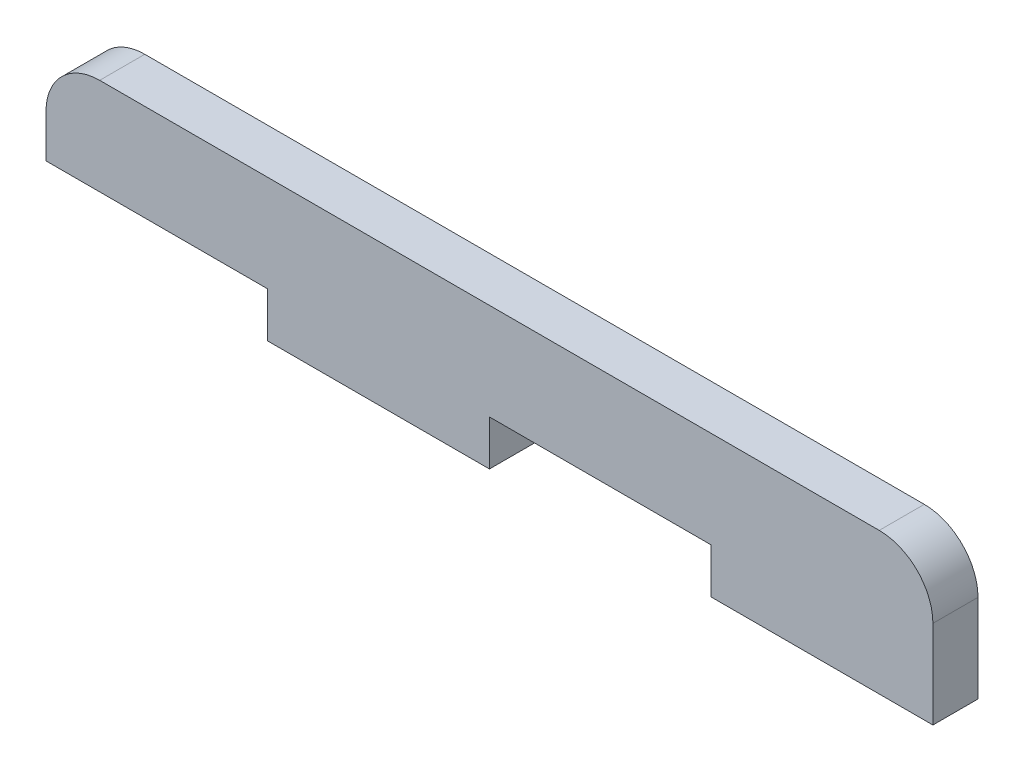
ISO-10303-21;
HEADER;
FILE_DESCRIPTION(('STEP AP214'),'2;1');
FILE_NAME('part.step','',(''),(''),'','','');
FILE_SCHEMA(('AUTOMOTIVE_DESIGN { 1 0 10303 214 1 1 1 1 }'));
ENDSEC;
DATA;
#1=APPLICATION_CONTEXT('core data for automotive mechanical design processes');
#2=APPLICATION_PROTOCOL_DEFINITION('international standard','automotive_design',2000,#1);
#3=PRODUCT_CONTEXT('',#1,'mechanical');
#4=PRODUCT('Part','Part','',(#3));
#5=PRODUCT_RELATED_PRODUCT_CATEGORY('part','',(#4));
#6=PRODUCT_DEFINITION_FORMATION('','',#4);
#7=PRODUCT_DEFINITION_CONTEXT('part definition',#1,'design');
#8=PRODUCT_DEFINITION('design','',#6,#7);
#9=PRODUCT_DEFINITION_SHAPE('','',#8);
#10=(LENGTH_UNIT() NAMED_UNIT(*) SI_UNIT(.MILLI.,.METRE.));
#11=(NAMED_UNIT(*) PLANE_ANGLE_UNIT() SI_UNIT($,.RADIAN.));
#12=(NAMED_UNIT(*) SI_UNIT($,.STERADIAN.) SOLID_ANGLE_UNIT());
#13=UNCERTAINTY_MEASURE_WITH_UNIT(LENGTH_MEASURE(1.E-05),#10,'distance_accuracy_value','');
#14=(GEOMETRIC_REPRESENTATION_CONTEXT(3) GLOBAL_UNCERTAINTY_ASSIGNED_CONTEXT((#13)) GLOBAL_UNIT_ASSIGNED_CONTEXT((#10,
#11,#12)) REPRESENTATION_CONTEXT('',''));
#15=CARTESIAN_POINT('',(0.,0.,0.));
#16=DIRECTION('',(0.,0.,1.));
#17=DIRECTION('',(1.,0.,0.));
#18=AXIS2_PLACEMENT_3D('',#15,#16,#17);
#19=CARTESIAN_POINT('',(-57.0553003620511,-9.15145110238763,5.334));
#20=DIRECTION('',(0.,1.,0.));
#21=DIRECTION('',(0.,0.,1.));
#22=AXIS2_PLACEMENT_3D('',#19,#20,#21);
#23=PLANE('',#22);
#24=DIRECTION('',(1.,0.,0.));
#25=VECTOR('',#24,1.);
#26=CARTESIAN_POINT('',(-57.0553003620511,-9.15145110238763,0.));
#27=LINE('',#26,#25);
#28=CARTESIAN_POINT('',(-30.8298003620511,-9.15145110238763,0.));
#29=VERTEX_POINT('',#28);
#30=CARTESIAN_POINT('',(-4.60430036205114,-9.15145110238763,0.));
#31=VERTEX_POINT('',#30);
#32=EDGE_CURVE('E146',#29,#31,#27,.T.);
#33=ORIENTED_EDGE('',*,*,#32,.T.);
#34=DIRECTION('',(0.,0.,1.));
#35=VECTOR('',#34,1.);
#36=CARTESIAN_POINT('',(-4.60430036205114,-9.15145110238763,0.));
#37=LINE('',#36,#35);
#38=CARTESIAN_POINT('',(-4.60430036205114,-9.15145110238763,5.334));
#39=VERTEX_POINT('',#38);
#40=EDGE_CURVE('E127',#31,#39,#37,.T.);
#41=ORIENTED_EDGE('',*,*,#40,.T.);
#42=DIRECTION('',(1.,0.,0.));
#43=VECTOR('',#42,1.);
#44=CARTESIAN_POINT('',(-57.0553003620511,-9.15145110238763,5.334));
#45=LINE('',#44,#43);
#46=CARTESIAN_POINT('',(-30.8298003620511,-9.15145110238763,5.334));
#47=VERTEX_POINT('',#46);
#48=EDGE_CURVE('E232',#47,#39,#45,.T.);
#49=ORIENTED_EDGE('',*,*,#48,.F.);
#50=DIRECTION('',(0.,0.,1.));
#51=VECTOR('',#50,1.);
#52=CARTESIAN_POINT('',(-30.8298003620511,-9.15145110238763,0.));
#53=LINE('',#52,#51);
#54=EDGE_CURVE('E152',#29,#47,#53,.T.);
#55=ORIENTED_EDGE('',*,*,#54,.F.);
#56=EDGE_LOOP('',(#33,#41,#49,#55));
#57=FACE_BOUND('',#56,.T.);
#58=ADVANCED_FACE('F35',(#57),#23,.F.);
#59=CARTESIAN_POINT('',(-57.0553003620511,7.61254889761237,5.334));
#60=DIRECTION('',(1.,0.,0.));
#61=DIRECTION('',(0.,1.,0.));
#62=AXIS2_PLACEMENT_3D('',#59,#60,#61);
#63=PLANE('',#62);
#64=DIRECTION('',(0.,-1.,0.));
#65=VECTOR('',#64,1.);
#66=CARTESIAN_POINT('',(-57.0553003620511,7.61254889761237,5.334));
#67=LINE('',#66,#65);
#68=CARTESIAN_POINT('',(-57.0553003620511,1.26254889761237,5.334));
#69=VERTEX_POINT('',#68);
#70=CARTESIAN_POINT('',(-57.0553003620511,-3.81745110238763,5.334));
#71=VERTEX_POINT('',#70);
#72=EDGE_CURVE('E164',#69,#71,#67,.T.);
#73=ORIENTED_EDGE('',*,*,#72,.F.);
#74=DIRECTION('',(0.,0.,-1.));
#75=VECTOR('',#74,1.);
#76=CARTESIAN_POINT('',(-57.0553003620511,1.26254889761237,5.334));
#77=LINE('',#76,#75);
#78=CARTESIAN_POINT('',(-57.0553003620511,1.26254889761237,0.));
#79=VERTEX_POINT('',#78);
#80=EDGE_CURVE('E11',#69,#79,#77,.T.);
#81=ORIENTED_EDGE('',*,*,#80,.T.);
#82=DIRECTION('',(0.,-1.,0.));
#83=VECTOR('',#82,1.);
#84=CARTESIAN_POINT('',(-57.0553003620511,7.61254889761237,0.));
#85=LINE('',#84,#83);
#86=CARTESIAN_POINT('',(-57.0553003620511,-3.81745110238763,0.));
#87=VERTEX_POINT('',#86);
#88=EDGE_CURVE('E158',#79,#87,#85,.T.);
#89=ORIENTED_EDGE('',*,*,#88,.T.);
#90=DIRECTION('',(0.,0.,1.));
#91=VECTOR('',#90,1.);
#92=CARTESIAN_POINT('',(-57.0553003620511,-3.81745110238763,0.));
#93=LINE('',#92,#91);
#94=EDGE_CURVE('E225',#87,#71,#93,.T.);
#95=ORIENTED_EDGE('',*,*,#94,.T.);
#96=EDGE_LOOP('',(#73,#81,#89,#95));
#97=FACE_BOUND('',#96,.T.);
#98=ADVANCED_FACE('F250',(#97),#63,.F.);
#99=CARTESIAN_POINT('',(21.6211996379489,-9.15145110238763,5.334));
#100=VERTEX_POINT('',#99);
#101=CARTESIAN_POINT('',(47.8466996379489,-9.15145110238763,5.334));
#102=VERTEX_POINT('',#101);
#103=EDGE_CURVE('E197',#100,#102,#45,.T.);
#104=ORIENTED_EDGE('',*,*,#103,.F.);
#105=DIRECTION('',(0.,0.,1.));
#106=VECTOR('',#105,1.);
#107=CARTESIAN_POINT('',(21.6211996379489,-9.15145110238763,0.));
#108=LINE('',#107,#106);
#109=CARTESIAN_POINT('',(21.6211996379489,-9.15145110238763,0.));
#110=VERTEX_POINT('',#109);
#111=EDGE_CURVE('E138',#110,#100,#108,.T.);
#112=ORIENTED_EDGE('',*,*,#111,.F.);
#113=CARTESIAN_POINT('',(47.8466996379489,-9.15145110238763,0.));
#114=VERTEX_POINT('',#113);
#115=EDGE_CURVE('E154',#110,#114,#27,.T.);
#116=ORIENTED_EDGE('',*,*,#115,.T.);
#117=DIRECTION('',(0.,0.,-1.));
#118=VECTOR('',#117,1.);
#119=CARTESIAN_POINT('',(47.8466996379489,-9.15145110238763,5.334));
#120=LINE('',#119,#118);
#121=EDGE_CURVE('E165',#102,#114,#120,.T.);
#122=ORIENTED_EDGE('',*,*,#121,.F.);
#123=EDGE_LOOP('',(#104,#112,#116,#122));
#124=FACE_BOUND('',#123,.T.);
#125=ADVANCED_FACE('F195',(#124),#23,.F.);
#126=CARTESIAN_POINT('',(47.8466996379489,7.61254889761237,5.334));
#127=DIRECTION('',(-1.,0.,0.));
#128=DIRECTION('',(0.,-1.,0.));
#129=AXIS2_PLACEMENT_3D('',#126,#127,#128);
#130=PLANE('',#129);
#131=DIRECTION('',(0.,1.,0.));
#132=VECTOR('',#131,1.);
#133=CARTESIAN_POINT('',(47.8466996379489,7.61254889761237,0.));
#134=LINE('',#133,#132);
#135=CARTESIAN_POINT('',(47.8466996379489,1.26254889761237,0.));
#136=VERTEX_POINT('',#135);
#137=EDGE_CURVE('E153',#114,#136,#134,.T.);
#138=ORIENTED_EDGE('',*,*,#137,.T.);
#139=DIRECTION('',(0.,0.,-1.));
#140=VECTOR('',#139,1.);
#141=CARTESIAN_POINT('',(47.8466996379489,1.26254889761237,5.334));
#142=LINE('',#141,#140);
#143=CARTESIAN_POINT('',(47.8466996379489,1.26254889761237,5.334));
#144=VERTEX_POINT('',#143);
#145=EDGE_CURVE('E58',#136,#144,#142,.F.);
#146=ORIENTED_EDGE('',*,*,#145,.T.);
#147=DIRECTION('',(0.,1.,0.));
#148=VECTOR('',#147,1.);
#149=CARTESIAN_POINT('',(47.8466996379489,7.61254889761237,5.334));
#150=LINE('',#149,#148);
#151=EDGE_CURVE('E182',#102,#144,#150,.T.);
#152=ORIENTED_EDGE('',*,*,#151,.F.);
#153=ORIENTED_EDGE('',*,*,#121,.T.);
#154=EDGE_LOOP('',(#138,#146,#152,#153));
#155=FACE_BOUND('',#154,.T.);
#156=ADVANCED_FACE('F191',(#155),#130,.F.);
#157=CARTESIAN_POINT('',(-57.0553003620511,7.61254889761237,5.334));
#158=DIRECTION('',(0.,-1.,0.));
#159=DIRECTION('',(0.,0.,-1.));
#160=AXIS2_PLACEMENT_3D('',#157,#158,#159);
#161=PLANE('',#160);
#162=DIRECTION('',(-1.,0.,0.));
#163=VECTOR('',#162,1.);
#164=CARTESIAN_POINT('',(-57.0553003620511,7.61254889761237,5.334));
#165=LINE('',#164,#163);
#166=CARTESIAN_POINT('',(41.4966996379489,7.61254889761237,5.334));
#167=VERTEX_POINT('',#166);
#168=CARTESIAN_POINT('',(-50.7053003620511,7.61254889761237,5.334));
#169=VERTEX_POINT('',#168);
#170=EDGE_CURVE('E169',#167,#169,#165,.T.);
#171=ORIENTED_EDGE('',*,*,#170,.F.);
#172=DIRECTION('',(0.,0.,-1.));
#173=VECTOR('',#172,1.);
#174=CARTESIAN_POINT('',(41.4966996379489,7.61254889761237,5.334));
#175=LINE('',#174,#173);
#176=CARTESIAN_POINT('',(41.4966996379489,7.61254889761237,0.));
#177=VERTEX_POINT('',#176);
#178=EDGE_CURVE('E171',#167,#177,#175,.T.);
#179=ORIENTED_EDGE('',*,*,#178,.T.);
#180=DIRECTION('',(-1.,0.,0.));
#181=VECTOR('',#180,1.);
#182=CARTESIAN_POINT('',(-57.0553003620511,7.61254889761237,0.));
#183=LINE('',#182,#181);
#184=CARTESIAN_POINT('',(-50.7053003620511,7.61254889761237,0.));
#185=VERTEX_POINT('',#184);
#186=EDGE_CURVE('E156',#177,#185,#183,.T.);
#187=ORIENTED_EDGE('',*,*,#186,.T.);
#188=DIRECTION('',(0.,0.,-1.));
#189=VECTOR('',#188,1.);
#190=CARTESIAN_POINT('',(-50.7053003620511,7.61254889761237,5.334));
#191=LINE('',#190,#189);
#192=EDGE_CURVE('E168',#185,#169,#191,.F.);
#193=ORIENTED_EDGE('',*,*,#192,.T.);
#194=EDGE_LOOP('',(#171,#179,#187,#193));
#195=FACE_BOUND('',#194,.T.);
#196=ADVANCED_FACE('F186',(#195),#161,.F.);
#197=CARTESIAN_POINT('',(0.,0.,5.334));
#198=DIRECTION('',(0.,0.,1.));
#199=DIRECTION('',(1.,0.,0.));
#200=AXIS2_PLACEMENT_3D('',#197,#198,#199);
#201=PLANE('',#200);
#202=ORIENTED_EDGE('',*,*,#151,.T.);
#203=CARTESIAN_POINT('',(41.4966996379489,1.26254889761237,5.334));
#204=DIRECTION('',(0.,0.,1.));
#205=DIRECTION('',(1.,0.,0.));
#206=AXIS2_PLACEMENT_3D('',#203,#204,#205);
#207=CIRCLE('',#206,6.35);
#208=EDGE_CURVE('E43',#144,#167,#207,.T.);
#209=ORIENTED_EDGE('',*,*,#208,.T.);
#210=ORIENTED_EDGE('',*,*,#170,.T.);
#211=CARTESIAN_POINT('',(-50.7053003620511,1.26254889761237,5.334));
#212=DIRECTION('',(0.,0.,1.));
#213=DIRECTION('',(1.,0.,0.));
#214=AXIS2_PLACEMENT_3D('',#211,#212,#213);
#215=CIRCLE('',#214,6.35);
#216=EDGE_CURVE('E50',#169,#69,#215,.T.);
#217=ORIENTED_EDGE('',*,*,#216,.T.);
#218=ORIENTED_EDGE('',*,*,#72,.T.);
#219=DIRECTION('',(-1.,0.,0.));
#220=VECTOR('',#219,1.);
#221=CARTESIAN_POINT('',(-57.0553003620511,-3.81745110238763,5.334));
#222=LINE('',#221,#220);
#223=CARTESIAN_POINT('',(-30.8298003620511,-3.81745110238763,5.334));
#224=VERTEX_POINT('',#223);
#225=EDGE_CURVE('E218',#224,#71,#222,.T.);
#226=ORIENTED_EDGE('',*,*,#225,.F.);
#227=DIRECTION('',(0.,1.,0.));
#228=VECTOR('',#227,1.);
#229=CARTESIAN_POINT('',(-30.8298003620511,-9.15145110238763,5.334));
#230=LINE('',#229,#228);
#231=EDGE_CURVE('E211',#47,#224,#230,.T.);
#232=ORIENTED_EDGE('',*,*,#231,.F.);
#233=ORIENTED_EDGE('',*,*,#48,.T.);
#234=DIRECTION('',(0.,-1.,0.));
#235=VECTOR('',#234,1.);
#236=CARTESIAN_POINT('',(-4.60430036205114,-9.15145110238763,5.334));
#237=LINE('',#236,#235);
#238=CARTESIAN_POINT('',(-4.60430036205113,-3.81745110238763,5.334));
#239=VERTEX_POINT('',#238);
#240=EDGE_CURVE('E133',#239,#39,#237,.T.);
#241=ORIENTED_EDGE('',*,*,#240,.F.);
#242=DIRECTION('',(-1.,0.,0.));
#243=VECTOR('',#242,1.);
#244=CARTESIAN_POINT('',(-4.60430036205113,-3.81745110238763,5.334));
#245=LINE('',#244,#243);
#246=CARTESIAN_POINT('',(21.6211996379489,-3.81745110238763,5.334));
#247=VERTEX_POINT('',#246);
#248=EDGE_CURVE('E149',#247,#239,#245,.T.);
#249=ORIENTED_EDGE('',*,*,#248,.F.);
#250=DIRECTION('',(0.,1.,0.));
#251=VECTOR('',#250,1.);
#252=CARTESIAN_POINT('',(21.6211996379489,-9.15145110238763,5.334));
#253=LINE('',#252,#251);
#254=EDGE_CURVE('E204',#100,#247,#253,.T.);
#255=ORIENTED_EDGE('',*,*,#254,.F.);
#256=ORIENTED_EDGE('',*,*,#103,.T.);
#257=EDGE_LOOP('',(#202,#209,#210,#217,#218,#226,#232,#233,#241,#249,#255,#256));
#258=FACE_BOUND('',#257,.T.);
#259=ADVANCED_FACE('F181',(#258),#201,.T.);
#260=CARTESIAN_POINT('',(0.,0.,0.));
#261=DIRECTION('',(0.,0.,1.));
#262=DIRECTION('',(1.,0.,0.));
#263=AXIS2_PLACEMENT_3D('',#260,#261,#262);
#264=PLANE('',#263);
#265=ORIENTED_EDGE('',*,*,#186,.F.);
#266=CARTESIAN_POINT('',(41.4966996379489,1.26254889761237,0.));
#267=DIRECTION('',(0.,0.,1.));
#268=DIRECTION('',(1.,0.,0.));
#269=AXIS2_PLACEMENT_3D('',#266,#267,#268);
#270=CIRCLE('',#269,6.35);
#271=EDGE_CURVE('E176',#177,#136,#270,.F.);
#272=ORIENTED_EDGE('',*,*,#271,.T.);
#273=ORIENTED_EDGE('',*,*,#137,.F.);
#274=ORIENTED_EDGE('',*,*,#115,.F.);
#275=DIRECTION('',(0.,1.,0.));
#276=VECTOR('',#275,1.);
#277=CARTESIAN_POINT('',(21.6211996379489,-9.15145110238763,0.));
#278=LINE('',#277,#276);
#279=CARTESIAN_POINT('',(21.6211996379489,-3.81745110238763,0.));
#280=VERTEX_POINT('',#279);
#281=EDGE_CURVE('E148',#110,#280,#278,.T.);
#282=ORIENTED_EDGE('',*,*,#281,.T.);
#283=DIRECTION('',(-1.,0.,0.));
#284=VECTOR('',#283,1.);
#285=CARTESIAN_POINT('',(-4.60430036205113,-3.81745110238763,0.));
#286=LINE('',#285,#284);
#287=CARTESIAN_POINT('',(-4.60430036205113,-3.81745110238763,0.));
#288=VERTEX_POINT('',#287);
#289=EDGE_CURVE('E139',#280,#288,#286,.T.);
#290=ORIENTED_EDGE('',*,*,#289,.T.);
#291=DIRECTION('',(0.,-1.,0.));
#292=VECTOR('',#291,1.);
#293=CARTESIAN_POINT('',(-4.60430036205114,-9.15145110238763,0.));
#294=LINE('',#293,#292);
#295=EDGE_CURVE('E130',#288,#31,#294,.T.);
#296=ORIENTED_EDGE('',*,*,#295,.T.);
#297=ORIENTED_EDGE('',*,*,#32,.F.);
#298=DIRECTION('',(0.,1.,0.));
#299=VECTOR('',#298,1.);
#300=CARTESIAN_POINT('',(-30.8298003620511,-9.15145110238763,0.));
#301=LINE('',#300,#299);
#302=CARTESIAN_POINT('',(-30.8298003620511,-3.81745110238763,0.));
#303=VERTEX_POINT('',#302);
#304=EDGE_CURVE('E215',#29,#303,#301,.T.);
#305=ORIENTED_EDGE('',*,*,#304,.T.);
#306=DIRECTION('',(-1.,0.,0.));
#307=VECTOR('',#306,1.);
#308=CARTESIAN_POINT('',(-57.0553003620511,-3.81745110238763,0.));
#309=LINE('',#308,#307);
#310=EDGE_CURVE('E217',#303,#87,#309,.T.);
#311=ORIENTED_EDGE('',*,*,#310,.T.);
#312=ORIENTED_EDGE('',*,*,#88,.F.);
#313=CARTESIAN_POINT('',(-50.7053003620511,1.26254889761237,0.));
#314=DIRECTION('',(0.,0.,1.));
#315=DIRECTION('',(1.,0.,0.));
#316=AXIS2_PLACEMENT_3D('',#313,#314,#315);
#317=CIRCLE('',#316,6.35);
#318=EDGE_CURVE('E174',#79,#185,#317,.F.);
#319=ORIENTED_EDGE('',*,*,#318,.T.);
#320=EDGE_LOOP('',(#265,#272,#273,#274,#282,#290,#296,#297,#305,#311,#312,#319));
#321=FACE_BOUND('',#320,.T.);
#322=ADVANCED_FACE('F144',(#321),#264,.F.);
#323=CARTESIAN_POINT('',(-57.0553003620511,-3.81745110238763,0.));
#324=DIRECTION('',(0.,1.,0.));
#325=DIRECTION('',(0.,0.,1.));
#326=AXIS2_PLACEMENT_3D('',#323,#324,#325);
#327=PLANE('',#326);
#328=ORIENTED_EDGE('',*,*,#225,.T.);
#329=ORIENTED_EDGE('',*,*,#94,.F.);
#330=ORIENTED_EDGE('',*,*,#310,.F.);
#331=DIRECTION('',(0.,0.,1.));
#332=VECTOR('',#331,1.);
#333=CARTESIAN_POINT('',(-30.8298003620511,-3.81745110238763,0.));
#334=LINE('',#333,#332);
#335=EDGE_CURVE('E228',#303,#224,#334,.T.);
#336=ORIENTED_EDGE('',*,*,#335,.T.);
#337=EDGE_LOOP('',(#328,#329,#330,#336));
#338=FACE_BOUND('',#337,.T.);
#339=ADVANCED_FACE('F269',(#338),#327,.F.);
#340=CARTESIAN_POINT('',(-30.8298003620511,-9.15145110238763,0.));
#341=DIRECTION('',(1.,0.,0.));
#342=DIRECTION('',(0.,1.,0.));
#343=AXIS2_PLACEMENT_3D('',#340,#341,#342);
#344=PLANE('',#343);
#345=ORIENTED_EDGE('',*,*,#231,.T.);
#346=ORIENTED_EDGE('',*,*,#335,.F.);
#347=ORIENTED_EDGE('',*,*,#304,.F.);
#348=ORIENTED_EDGE('',*,*,#54,.T.);
#349=EDGE_LOOP('',(#345,#346,#347,#348));
#350=FACE_BOUND('',#349,.T.);
#351=ADVANCED_FACE('F247',(#350),#344,.F.);
#352=CARTESIAN_POINT('',(-4.60430036205114,-9.15145110238763,0.));
#353=DIRECTION('',(-1.,0.,0.));
#354=DIRECTION('',(0.,-1.,0.));
#355=AXIS2_PLACEMENT_3D('',#352,#353,#354);
#356=PLANE('',#355);
#357=ORIENTED_EDGE('',*,*,#240,.T.);
#358=ORIENTED_EDGE('',*,*,#40,.F.);
#359=ORIENTED_EDGE('',*,*,#295,.F.);
#360=DIRECTION('',(0.,0.,1.));
#361=VECTOR('',#360,1.);
#362=CARTESIAN_POINT('',(-4.60430036205113,-3.81745110238763,0.));
#363=LINE('',#362,#361);
#364=EDGE_CURVE('E209',#288,#239,#363,.T.);
#365=ORIENTED_EDGE('',*,*,#364,.T.);
#366=EDGE_LOOP('',(#357,#358,#359,#365));
#367=FACE_BOUND('',#366,.T.);
#368=ADVANCED_FACE('F129',(#367),#356,.F.);
#369=CARTESIAN_POINT('',(-4.60430036205113,-3.81745110238763,0.));
#370=DIRECTION('',(0.,1.,0.));
#371=DIRECTION('',(0.,0.,1.));
#372=AXIS2_PLACEMENT_3D('',#369,#370,#371);
#373=PLANE('',#372);
#374=ORIENTED_EDGE('',*,*,#248,.T.);
#375=ORIENTED_EDGE('',*,*,#364,.F.);
#376=ORIENTED_EDGE('',*,*,#289,.F.);
#377=DIRECTION('',(0.,0.,1.));
#378=VECTOR('',#377,1.);
#379=CARTESIAN_POINT('',(21.6211996379489,-3.81745110238763,0.));
#380=LINE('',#379,#378);
#381=EDGE_CURVE('E212',#280,#247,#380,.T.);
#382=ORIENTED_EDGE('',*,*,#381,.T.);
#383=EDGE_LOOP('',(#374,#375,#376,#382));
#384=FACE_BOUND('',#383,.T.);
#385=ADVANCED_FACE('F239',(#384),#373,.F.);
#386=CARTESIAN_POINT('',(21.6211996379489,-9.15145110238763,0.));
#387=DIRECTION('',(1.,0.,0.));
#388=DIRECTION('',(0.,0.,-1.));
#389=AXIS2_PLACEMENT_3D('',#386,#387,#388);
#390=PLANE('',#389);
#391=ORIENTED_EDGE('',*,*,#254,.T.);
#392=ORIENTED_EDGE('',*,*,#381,.F.);
#393=ORIENTED_EDGE('',*,*,#281,.F.);
#394=ORIENTED_EDGE('',*,*,#111,.T.);
#395=EDGE_LOOP('',(#391,#392,#393,#394));
#396=FACE_BOUND('',#395,.T.);
#397=ADVANCED_FACE('F237',(#396),#390,.F.);
#398=CARTESIAN_POINT('',(41.4966996379489,1.26254889761237,5.334));
#399=DIRECTION('',(0.,0.,-1.));
#400=DIRECTION('',(-1.,0.,0.));
#401=AXIS2_PLACEMENT_3D('',#398,#399,#400);
#402=CYLINDRICAL_SURFACE('',#401,6.35);
#403=ORIENTED_EDGE('',*,*,#208,.F.);
#404=ORIENTED_EDGE('',*,*,#145,.F.);
#405=ORIENTED_EDGE('',*,*,#271,.F.);
#406=ORIENTED_EDGE('',*,*,#178,.F.);
#407=EDGE_LOOP('',(#403,#404,#405,#406));
#408=FACE_BOUND('',#407,.T.);
#409=ADVANCED_FACE('F188',(#408),#402,.T.);
#410=CARTESIAN_POINT('',(-50.7053003620511,1.26254889761237,5.334));
#411=DIRECTION('',(0.,0.,-1.));
#412=DIRECTION('',(-1.,0.,0.));
#413=AXIS2_PLACEMENT_3D('',#410,#411,#412);
#414=CYLINDRICAL_SURFACE('',#413,6.35);
#415=ORIENTED_EDGE('',*,*,#216,.F.);
#416=ORIENTED_EDGE('',*,*,#192,.F.);
#417=ORIENTED_EDGE('',*,*,#318,.F.);
#418=ORIENTED_EDGE('',*,*,#80,.F.);
#419=EDGE_LOOP('',(#415,#416,#417,#418));
#420=FACE_BOUND('',#419,.T.);
#421=ADVANCED_FACE('F37',(#420),#414,.T.);
#422=CLOSED_SHELL('',(#58,#98,#125,#156,#196,#259,#322,#339,#351,#368,#385,#397,#409,#421));
#423=MANIFOLD_SOLID_BREP('B2',#422);
#424=ADVANCED_BREP_SHAPE_REPRESENTATION('',(#18,#423),#14);
#425=SHAPE_DEFINITION_REPRESENTATION(#9,#424);
ENDSEC;
END-ISO-10303-21;
